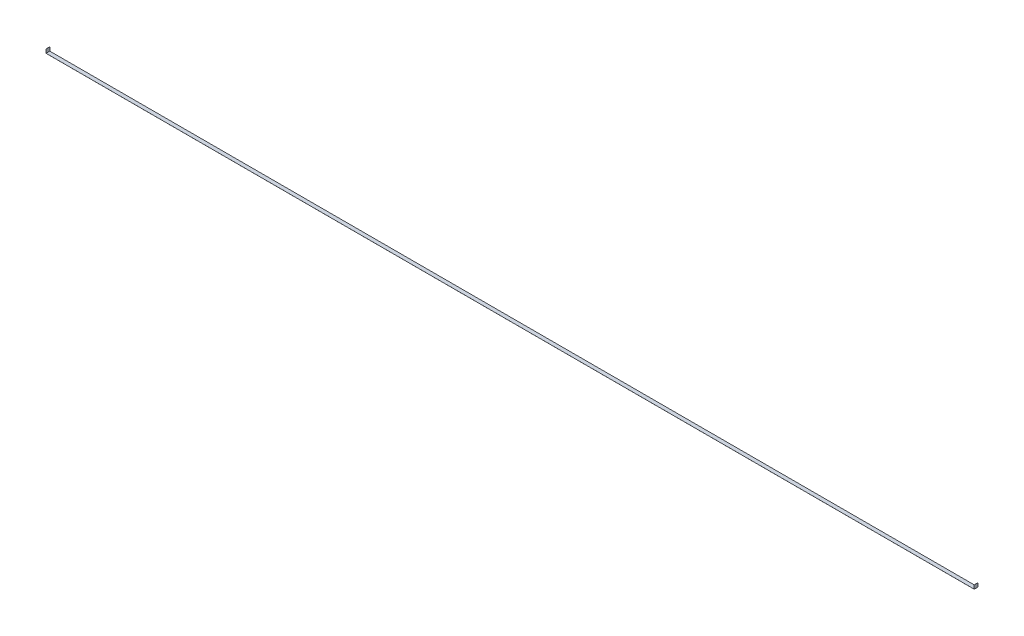
ISO-10303-21;
HEADER;
FILE_DESCRIPTION(('STEP AP214'),'2;1');
FILE_NAME('part.step','',(''),(''),'','','');
FILE_SCHEMA(('AUTOMOTIVE_DESIGN { 1 0 10303 214 1 1 1 1 }'));
ENDSEC;
DATA;
#1=APPLICATION_CONTEXT('core data for automotive mechanical design processes');
#2=APPLICATION_PROTOCOL_DEFINITION('international standard','automotive_design',2000,#1);
#3=PRODUCT_CONTEXT('',#1,'mechanical');
#4=PRODUCT('Part','Part','',(#3));
#5=PRODUCT_RELATED_PRODUCT_CATEGORY('part','',(#4));
#6=PRODUCT_DEFINITION_FORMATION('','',#4);
#7=PRODUCT_DEFINITION_CONTEXT('part definition',#1,'design');
#8=PRODUCT_DEFINITION('design','',#6,#7);
#9=PRODUCT_DEFINITION_SHAPE('','',#8);
#10=(LENGTH_UNIT() NAMED_UNIT(*) SI_UNIT(.MILLI.,.METRE.));
#11=(NAMED_UNIT(*) PLANE_ANGLE_UNIT() SI_UNIT($,.RADIAN.));
#12=(NAMED_UNIT(*) SI_UNIT($,.STERADIAN.) SOLID_ANGLE_UNIT());
#13=UNCERTAINTY_MEASURE_WITH_UNIT(LENGTH_MEASURE(1.E-05),#10,'distance_accuracy_value','');
#14=(GEOMETRIC_REPRESENTATION_CONTEXT(3) GLOBAL_UNCERTAINTY_ASSIGNED_CONTEXT((#13)) GLOBAL_UNIT_ASSIGNED_CONTEXT((#10,
#11,#12)) REPRESENTATION_CONTEXT('',''));
#15=CARTESIAN_POINT('',(0.,0.,0.));
#16=DIRECTION('',(0.,0.,1.));
#17=DIRECTION('',(1.,0.,0.));
#18=AXIS2_PLACEMENT_3D('',#15,#16,#17);
#19=CARTESIAN_POINT('',(3137.154,1.1524783632736E-12,25.4));
#20=DIRECTION('',(-1.,0.,0.));
#21=DIRECTION('',(0.,0.,1.));
#22=AXIS2_PLACEMENT_3D('',#19,#20,#21);
#23=PLANE('',#22);
#24=DIRECTION('',(0.,1.,0.));
#25=VECTOR('',#24,1.);
#26=CARTESIAN_POINT('',(3137.154,1.1524783632736E-12,0.));
#27=LINE('',#26,#25);
#28=CARTESIAN_POINT('',(3137.154,-0.253999999998847,0.));
#29=VERTEX_POINT('',#28);
#30=CARTESIAN_POINT('',(3137.154,25.4000000000011,0.));
#31=VERTEX_POINT('',#30);
#32=EDGE_CURVE('E136',#29,#31,#27,.T.);
#33=ORIENTED_EDGE('',*,*,#32,.T.);
#34=DIRECTION('',(0.,0.,-1.));
#35=VECTOR('',#34,1.);
#36=CARTESIAN_POINT('',(3137.154,25.4000000000011,25.4));
#37=LINE('',#36,#35);
#38=CARTESIAN_POINT('',(3137.154,25.4000000000011,25.4));
#39=VERTEX_POINT('',#38);
#40=EDGE_CURVE('E11',#39,#31,#37,.T.);
#41=ORIENTED_EDGE('',*,*,#40,.F.);
#42=DIRECTION('',(0.,1.,0.));
#43=VECTOR('',#42,1.);
#44=CARTESIAN_POINT('',(3137.154,1.1524783632736E-12,25.4));
#45=LINE('',#44,#43);
#46=CARTESIAN_POINT('',(3137.154,-0.253999999998847,25.4));
#47=VERTEX_POINT('',#46);
#48=EDGE_CURVE('E94',#47,#39,#45,.T.);
#49=ORIENTED_EDGE('',*,*,#48,.F.);
#50=DIRECTION('',(0.,0.,-1.));
#51=VECTOR('',#50,1.);
#52=CARTESIAN_POINT('',(3137.154,-0.253999999998847,25.4));
#53=LINE('',#52,#51);
#54=EDGE_CURVE('E135',#47,#29,#53,.T.);
#55=ORIENTED_EDGE('',*,*,#54,.T.);
#56=EDGE_LOOP('',(#33,#41,#49,#55));
#57=FACE_BOUND('',#56,.T.);
#58=ADVANCED_FACE('F39',(#57),#23,.F.);
#59=CARTESIAN_POINT('',(3136.9,25.4000000000011,25.4));
#60=DIRECTION('',(0.,1.,0.));
#61=DIRECTION('',(0.,0.,1.));
#62=AXIS2_PLACEMENT_3D('',#59,#60,#61);
#63=PLANE('',#62);
#64=DIRECTION('',(1.,0.,0.));
#65=VECTOR('',#64,1.);
#66=CARTESIAN_POINT('',(3136.9,25.4000000000011,0.));
#67=LINE('',#66,#65);
#68=CARTESIAN_POINT('',(3136.9,25.4000000000011,0.));
#69=VERTEX_POINT('',#68);
#70=EDGE_CURVE('E139',#69,#31,#67,.T.);
#71=ORIENTED_EDGE('',*,*,#70,.F.);
#72=DIRECTION('',(0.,0.,-1.));
#73=VECTOR('',#72,1.);
#74=CARTESIAN_POINT('',(3136.9,25.4000000000011,25.4));
#75=LINE('',#74,#73);
#76=CARTESIAN_POINT('',(3136.9,25.4000000000011,25.4));
#77=VERTEX_POINT('',#76);
#78=EDGE_CURVE('E47',#77,#69,#75,.T.);
#79=ORIENTED_EDGE('',*,*,#78,.F.);
#80=DIRECTION('',(1.,0.,0.));
#81=VECTOR('',#80,1.);
#82=CARTESIAN_POINT('',(3136.9,25.4000000000011,25.4));
#83=LINE('',#82,#81);
#84=EDGE_CURVE('E178',#77,#39,#83,.T.);
#85=ORIENTED_EDGE('',*,*,#84,.T.);
#86=ORIENTED_EDGE('',*,*,#40,.T.);
#87=EDGE_LOOP('',(#71,#79,#85,#86));
#88=FACE_BOUND('',#87,.T.);
#89=ADVANCED_FACE('F169',(#88),#63,.T.);
#90=CARTESIAN_POINT('',(3136.9,1.1524783632736E-12,25.4));
#91=DIRECTION('',(-1.,0.,0.));
#92=DIRECTION('',(0.,0.,1.));
#93=AXIS2_PLACEMENT_3D('',#90,#91,#92);
#94=PLANE('',#93);
#95=DIRECTION('',(0.,1.,0.));
#96=VECTOR('',#95,1.);
#97=CARTESIAN_POINT('',(3136.9,1.1524783632736E-12,0.));
#98=LINE('',#97,#96);
#99=CARTESIAN_POINT('',(3136.9,1.1524783632736E-12,0.));
#100=VERTEX_POINT('',#99);
#101=EDGE_CURVE('E142',#100,#69,#98,.T.);
#102=ORIENTED_EDGE('',*,*,#101,.F.);
#103=DIRECTION('',(0.,0.,-1.));
#104=VECTOR('',#103,1.);
#105=CARTESIAN_POINT('',(3136.9,1.1524783632736E-12,25.4));
#106=LINE('',#105,#104);
#107=CARTESIAN_POINT('',(3136.9,1.1524783632736E-12,25.4));
#108=VERTEX_POINT('',#107);
#109=EDGE_CURVE('E159',#108,#100,#106,.T.);
#110=ORIENTED_EDGE('',*,*,#109,.F.);
#111=DIRECTION('',(0.,1.,0.));
#112=VECTOR('',#111,1.);
#113=CARTESIAN_POINT('',(3136.9,1.1524783632736E-12,25.4));
#114=LINE('',#113,#112);
#115=EDGE_CURVE('E166',#108,#77,#114,.T.);
#116=ORIENTED_EDGE('',*,*,#115,.T.);
#117=ORIENTED_EDGE('',*,*,#78,.T.);
#118=EDGE_LOOP('',(#102,#110,#116,#117));
#119=FACE_BOUND('',#118,.T.);
#120=ADVANCED_FACE('F164',(#119),#94,.T.);
#121=CARTESIAN_POINT('',(-3136.9,0.,25.4));
#122=DIRECTION('',(0.,1.,0.));
#123=DIRECTION('',(-1.,0.,0.));
#124=AXIS2_PLACEMENT_3D('',#121,#122,#123);
#125=PLANE('',#124);
#126=DIRECTION('',(1.,0.,0.));
#127=VECTOR('',#126,1.);
#128=CARTESIAN_POINT('',(-3136.9,0.,0.));
#129=LINE('',#128,#127);
#130=CARTESIAN_POINT('',(-3136.9,0.,0.));
#131=VERTEX_POINT('',#130);
#132=EDGE_CURVE('E145',#131,#100,#129,.T.);
#133=ORIENTED_EDGE('',*,*,#132,.F.);
#134=DIRECTION('',(0.,0.,-1.));
#135=VECTOR('',#134,1.);
#136=CARTESIAN_POINT('',(-3136.9,0.,25.4));
#137=LINE('',#136,#135);
#138=CARTESIAN_POINT('',(-3136.9,0.,25.4));
#139=VERTEX_POINT('',#138);
#140=EDGE_CURVE('E157',#139,#131,#137,.T.);
#141=ORIENTED_EDGE('',*,*,#140,.F.);
#142=DIRECTION('',(1.,0.,0.));
#143=VECTOR('',#142,1.);
#144=CARTESIAN_POINT('',(-3136.9,0.,25.4));
#145=LINE('',#144,#143);
#146=EDGE_CURVE('E130',#139,#108,#145,.T.);
#147=ORIENTED_EDGE('',*,*,#146,.T.);
#148=ORIENTED_EDGE('',*,*,#109,.T.);
#149=EDGE_LOOP('',(#133,#141,#147,#148));
#150=FACE_BOUND('',#149,.T.);
#151=ADVANCED_FACE('F176',(#150),#125,.T.);
#152=CARTESIAN_POINT('',(-3136.9,25.4,25.4));
#153=DIRECTION('',(1.,0.,0.));
#154=DIRECTION('',(0.,0.,-1.));
#155=AXIS2_PLACEMENT_3D('',#152,#153,#154);
#156=PLANE('',#155);
#157=DIRECTION('',(0.,-1.,0.));
#158=VECTOR('',#157,1.);
#159=CARTESIAN_POINT('',(-3136.9,25.4,0.));
#160=LINE('',#159,#158);
#161=CARTESIAN_POINT('',(-3136.9,25.4,0.));
#162=VERTEX_POINT('',#161);
#163=EDGE_CURVE('E148',#162,#131,#160,.T.);
#164=ORIENTED_EDGE('',*,*,#163,.F.);
#165=DIRECTION('',(0.,0.,-1.));
#166=VECTOR('',#165,1.);
#167=CARTESIAN_POINT('',(-3136.9,25.4,25.4));
#168=LINE('',#167,#166);
#169=CARTESIAN_POINT('',(-3136.9,25.4,25.4));
#170=VERTEX_POINT('',#169);
#171=EDGE_CURVE('E118',#170,#162,#168,.T.);
#172=ORIENTED_EDGE('',*,*,#171,.F.);
#173=DIRECTION('',(0.,-1.,0.));
#174=VECTOR('',#173,1.);
#175=CARTESIAN_POINT('',(-3136.9,25.4,25.4));
#176=LINE('',#175,#174);
#177=EDGE_CURVE('E128',#170,#139,#176,.T.);
#178=ORIENTED_EDGE('',*,*,#177,.T.);
#179=ORIENTED_EDGE('',*,*,#140,.T.);
#180=EDGE_LOOP('',(#164,#172,#178,#179));
#181=FACE_BOUND('',#180,.T.);
#182=ADVANCED_FACE('F183',(#181),#156,.T.);
#183=CARTESIAN_POINT('',(-3137.154,25.4,25.4));
#184=DIRECTION('',(0.,1.,0.));
#185=DIRECTION('',(0.,0.,1.));
#186=AXIS2_PLACEMENT_3D('',#183,#184,#185);
#187=PLANE('',#186);
#188=DIRECTION('',(1.,0.,0.));
#189=VECTOR('',#188,1.);
#190=CARTESIAN_POINT('',(-3137.154,25.4,0.));
#191=LINE('',#190,#189);
#192=CARTESIAN_POINT('',(-3137.154,25.4,0.));
#193=VERTEX_POINT('',#192);
#194=EDGE_CURVE('E117',#193,#162,#191,.T.);
#195=ORIENTED_EDGE('',*,*,#194,.F.);
#196=DIRECTION('',(0.,0.,-1.));
#197=VECTOR('',#196,1.);
#198=CARTESIAN_POINT('',(-3137.154,25.4,25.4));
#199=LINE('',#198,#197);
#200=CARTESIAN_POINT('',(-3137.154,25.4,25.4));
#201=VERTEX_POINT('',#200);
#202=EDGE_CURVE('E111',#201,#193,#199,.T.);
#203=ORIENTED_EDGE('',*,*,#202,.F.);
#204=DIRECTION('',(1.,0.,0.));
#205=VECTOR('',#204,1.);
#206=CARTESIAN_POINT('',(-3137.154,25.4,25.4));
#207=LINE('',#206,#205);
#208=EDGE_CURVE('E115',#201,#170,#207,.T.);
#209=ORIENTED_EDGE('',*,*,#208,.T.);
#210=ORIENTED_EDGE('',*,*,#171,.T.);
#211=EDGE_LOOP('',(#195,#203,#209,#210));
#212=FACE_BOUND('',#211,.T.);
#213=ADVANCED_FACE('F113',(#212),#187,.T.);
#214=CARTESIAN_POINT('',(-3137.154,25.4,25.4));
#215=DIRECTION('',(1.,0.,0.));
#216=DIRECTION('',(0.,0.,-1.));
#217=AXIS2_PLACEMENT_3D('',#214,#215,#216);
#218=PLANE('',#217);
#219=DIRECTION('',(0.,1.,0.));
#220=VECTOR('',#219,1.);
#221=CARTESIAN_POINT('',(-3137.154,25.4,0.));
#222=LINE('',#221,#220);
#223=CARTESIAN_POINT('',(-3137.154,-0.254,0.));
#224=VERTEX_POINT('',#223);
#225=EDGE_CURVE('E82',#193,#224,#222,.F.);
#226=ORIENTED_EDGE('',*,*,#225,.T.);
#227=DIRECTION('',(0.,0.,-1.));
#228=VECTOR('',#227,1.);
#229=CARTESIAN_POINT('',(-3137.154,-0.254,25.4));
#230=LINE('',#229,#228);
#231=CARTESIAN_POINT('',(-3137.154,-0.254,25.4));
#232=VERTEX_POINT('',#231);
#233=EDGE_CURVE('E119',#232,#224,#230,.T.);
#234=ORIENTED_EDGE('',*,*,#233,.F.);
#235=DIRECTION('',(0.,1.,0.));
#236=VECTOR('',#235,1.);
#237=CARTESIAN_POINT('',(-3137.154,25.4,25.4));
#238=LINE('',#237,#236);
#239=EDGE_CURVE('E121',#201,#232,#238,.F.);
#240=ORIENTED_EDGE('',*,*,#239,.F.);
#241=ORIENTED_EDGE('',*,*,#202,.T.);
#242=EDGE_LOOP('',(#226,#234,#240,#241));
#243=FACE_BOUND('',#242,.T.);
#244=ADVANCED_FACE('F122',(#243),#218,.F.);
#245=CARTESIAN_POINT('',(-3136.9,-0.254,25.4));
#246=DIRECTION('',(0.,1.,0.));
#247=DIRECTION('',(-1.,0.,0.));
#248=AXIS2_PLACEMENT_3D('',#245,#246,#247);
#249=PLANE('',#248);
#250=DIRECTION('',(1.,0.,0.));
#251=VECTOR('',#250,1.);
#252=CARTESIAN_POINT('',(-3136.9,-0.254,0.));
#253=LINE('',#252,#251);
#254=EDGE_CURVE('E88',#224,#29,#253,.T.);
#255=ORIENTED_EDGE('',*,*,#254,.T.);
#256=ORIENTED_EDGE('',*,*,#54,.F.);
#257=DIRECTION('',(1.,0.,0.));
#258=VECTOR('',#257,1.);
#259=CARTESIAN_POINT('',(-3136.9,-0.254,25.4));
#260=LINE('',#259,#258);
#261=EDGE_CURVE('E55',#232,#47,#260,.T.);
#262=ORIENTED_EDGE('',*,*,#261,.F.);
#263=ORIENTED_EDGE('',*,*,#233,.T.);
#264=EDGE_LOOP('',(#255,#256,#262,#263));
#265=FACE_BOUND('',#264,.T.);
#266=ADVANCED_FACE('F185',(#265),#249,.F.);
#267=CARTESIAN_POINT('',(0.,0.,25.4));
#268=DIRECTION('',(0.,0.,-1.));
#269=DIRECTION('',(-1.,0.,0.));
#270=AXIS2_PLACEMENT_3D('',#267,#268,#269);
#271=PLANE('',#270);
#272=ORIENTED_EDGE('',*,*,#48,.T.);
#273=ORIENTED_EDGE('',*,*,#84,.F.);
#274=ORIENTED_EDGE('',*,*,#115,.F.);
#275=ORIENTED_EDGE('',*,*,#146,.F.);
#276=ORIENTED_EDGE('',*,*,#177,.F.);
#277=ORIENTED_EDGE('',*,*,#208,.F.);
#278=ORIENTED_EDGE('',*,*,#239,.T.);
#279=ORIENTED_EDGE('',*,*,#261,.T.);
#280=EDGE_LOOP('',(#272,#273,#274,#275,#276,#277,#278,#279));
#281=FACE_BOUND('',#280,.T.);
#282=ADVANCED_FACE('F125',(#281),#271,.F.);
#283=CARTESIAN_POINT('',(0.,0.,0.));
#284=DIRECTION('',(0.,0.,-1.));
#285=DIRECTION('',(-1.,0.,0.));
#286=AXIS2_PLACEMENT_3D('',#283,#284,#285);
#287=PLANE('',#286);
#288=ORIENTED_EDGE('',*,*,#32,.F.);
#289=ORIENTED_EDGE('',*,*,#254,.F.);
#290=ORIENTED_EDGE('',*,*,#225,.F.);
#291=ORIENTED_EDGE('',*,*,#194,.T.);
#292=ORIENTED_EDGE('',*,*,#163,.T.);
#293=ORIENTED_EDGE('',*,*,#132,.T.);
#294=ORIENTED_EDGE('',*,*,#101,.T.);
#295=ORIENTED_EDGE('',*,*,#70,.T.);
#296=EDGE_LOOP('',(#288,#289,#290,#291,#292,#293,#294,#295));
#297=FACE_BOUND('',#296,.T.);
#298=ADVANCED_FACE('F172',(#297),#287,.T.);
#299=CLOSED_SHELL('',(#58,#89,#120,#151,#182,#213,#244,#266,#282,#298));
#300=MANIFOLD_SOLID_BREP('B2',#299);
#301=ADVANCED_BREP_SHAPE_REPRESENTATION('',(#18,#300),#14);
#302=SHAPE_DEFINITION_REPRESENTATION(#9,#301);
ENDSEC;
END-ISO-10303-21;
